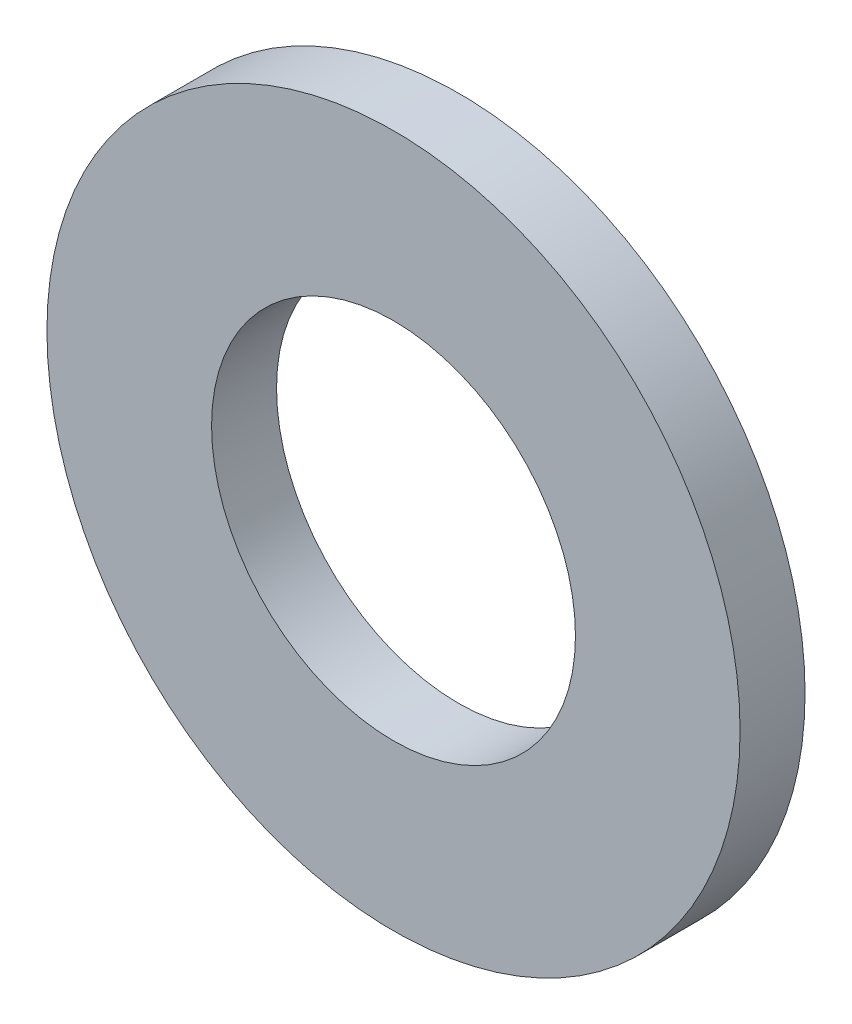
ISO-10303-21;
HEADER;
FILE_DESCRIPTION(('STEP AP214'),'2;1');
FILE_NAME('part.step','',(''),(''),'','','');
FILE_SCHEMA(('AUTOMOTIVE_DESIGN { 1 0 10303 214 1 1 1 1 }'));
ENDSEC;
DATA;
#1=APPLICATION_CONTEXT('core data for automotive mechanical design processes');
#2=APPLICATION_PROTOCOL_DEFINITION('international standard','automotive_design',2000,#1);
#3=PRODUCT_CONTEXT('',#1,'mechanical');
#4=PRODUCT('Part','Part','',(#3));
#5=PRODUCT_RELATED_PRODUCT_CATEGORY('part','',(#4));
#6=PRODUCT_DEFINITION_FORMATION('','',#4);
#7=PRODUCT_DEFINITION_CONTEXT('part definition',#1,'design');
#8=PRODUCT_DEFINITION('design','',#6,#7);
#9=PRODUCT_DEFINITION_SHAPE('','',#8);
#10=(LENGTH_UNIT() NAMED_UNIT(*) SI_UNIT(.MILLI.,.METRE.));
#11=(NAMED_UNIT(*) PLANE_ANGLE_UNIT() SI_UNIT($,.RADIAN.));
#12=(NAMED_UNIT(*) SI_UNIT($,.STERADIAN.) SOLID_ANGLE_UNIT());
#13=UNCERTAINTY_MEASURE_WITH_UNIT(LENGTH_MEASURE(1.E-05),#10,'distance_accuracy_value','');
#14=(GEOMETRIC_REPRESENTATION_CONTEXT(3) GLOBAL_UNCERTAINTY_ASSIGNED_CONTEXT((#13)) GLOBAL_UNIT_ASSIGNED_CONTEXT((#10,
#11,#12)) REPRESENTATION_CONTEXT('',''));
#15=CARTESIAN_POINT('',(0.,0.,0.));
#16=DIRECTION('',(0.,0.,1.));
#17=DIRECTION('',(1.,0.,0.));
#18=AXIS2_PLACEMENT_3D('',#15,#16,#17);
#19=CARTESIAN_POINT('',(0.,0.,1.5));
#20=DIRECTION('',(0.,0.,-1.));
#21=DIRECTION('',(-1.,0.,0.));
#22=AXIS2_PLACEMENT_3D('',#19,#20,#21);
#23=CYLINDRICAL_SURFACE('',#22,8.);
#24=CARTESIAN_POINT('',(0.,0.,1.5));
#25=DIRECTION('',(0.,0.,1.));
#26=DIRECTION('',(1.,0.,0.));
#27=AXIS2_PLACEMENT_3D('',#24,#25,#26);
#28=CIRCLE('',#27,8.);
#29=CARTESIAN_POINT('',(8.,0.,1.5));
#30=VERTEX_POINT('',#29);
#31=EDGE_CURVE('E10',#30,#30,#28,.T.);
#32=ORIENTED_EDGE('',*,*,#31,.F.);
#33=EDGE_LOOP('',(#32));
#34=FACE_BOUND('',#33,.T.);
#35=CARTESIAN_POINT('',(0.,0.,0.));
#36=DIRECTION('',(0.,0.,1.));
#37=DIRECTION('',(1.,0.,0.));
#38=AXIS2_PLACEMENT_3D('',#35,#36,#37);
#39=CIRCLE('',#38,8.);
#40=CARTESIAN_POINT('',(8.,0.,0.));
#41=VERTEX_POINT('',#40);
#42=EDGE_CURVE('E33',#41,#41,#39,.T.);
#43=ORIENTED_EDGE('',*,*,#42,.T.);
#44=EDGE_LOOP('',(#43));
#45=FACE_BOUND('',#44,.T.);
#46=ADVANCED_FACE('F30',(#34,#45),#23,.T.);
#47=CARTESIAN_POINT('',(0.,0.,1.5));
#48=DIRECTION('',(0.,0.,1.));
#49=DIRECTION('',(1.,0.,0.));
#50=AXIS2_PLACEMENT_3D('',#47,#48,#49);
#51=PLANE('',#50);
#52=CARTESIAN_POINT('',(0.,0.,1.5));
#53=DIRECTION('',(0.,0.,1.));
#54=DIRECTION('',(1.,0.,0.));
#55=AXIS2_PLACEMENT_3D('',#52,#53,#54);
#56=CIRCLE('',#55,4.2);
#57=CARTESIAN_POINT('',(4.2,0.,1.5));
#58=VERTEX_POINT('',#57);
#59=EDGE_CURVE('E42',#58,#58,#56,.T.);
#60=ORIENTED_EDGE('',*,*,#59,.F.);
#61=EDGE_LOOP('',(#60));
#62=FACE_BOUND('',#61,.T.);
#63=ORIENTED_EDGE('',*,*,#31,.T.);
#64=EDGE_LOOP('',(#63));
#65=FACE_BOUND('',#64,.T.);
#66=ADVANCED_FACE('F57',(#62,#65),#51,.T.);
#67=CARTESIAN_POINT('',(0.,0.,0.));
#68=DIRECTION('',(0.,0.,1.));
#69=DIRECTION('',(1.,0.,0.));
#70=AXIS2_PLACEMENT_3D('',#67,#68,#69);
#71=PLANE('',#70);
#72=CARTESIAN_POINT('',(0.,0.,0.));
#73=DIRECTION('',(0.,0.,1.));
#74=DIRECTION('',(1.,0.,0.));
#75=AXIS2_PLACEMENT_3D('',#72,#73,#74);
#76=CIRCLE('',#75,4.2);
#77=CARTESIAN_POINT('',(4.2,0.,0.));
#78=VERTEX_POINT('',#77);
#79=EDGE_CURVE('E40',#78,#78,#76,.T.);
#80=ORIENTED_EDGE('',*,*,#79,.T.);
#81=EDGE_LOOP('',(#80));
#82=FACE_BOUND('',#81,.T.);
#83=ORIENTED_EDGE('',*,*,#42,.F.);
#84=EDGE_LOOP('',(#83));
#85=FACE_BOUND('',#84,.T.);
#86=ADVANCED_FACE('F48',(#82,#85),#71,.F.);
#87=CARTESIAN_POINT('',(0.,0.,0.));
#88=DIRECTION('',(0.,0.,1.));
#89=DIRECTION('',(1.,0.,0.));
#90=AXIS2_PLACEMENT_3D('',#87,#88,#89);
#91=CYLINDRICAL_SURFACE('',#90,4.2);
#92=ORIENTED_EDGE('',*,*,#79,.F.);
#93=EDGE_LOOP('',(#92));
#94=FACE_BOUND('',#93,.T.);
#95=ORIENTED_EDGE('',*,*,#59,.T.);
#96=EDGE_LOOP('',(#95));
#97=FACE_BOUND('',#96,.T.);
#98=ADVANCED_FACE('F51',(#94,#97),#91,.F.);
#99=CLOSED_SHELL('',(#46,#66,#86,#98));
#100=MANIFOLD_SOLID_BREP('B2',#99);
#101=ADVANCED_BREP_SHAPE_REPRESENTATION('',(#18,#100),#14);
#102=SHAPE_DEFINITION_REPRESENTATION(#9,#101);
ENDSEC;
END-ISO-10303-21;
